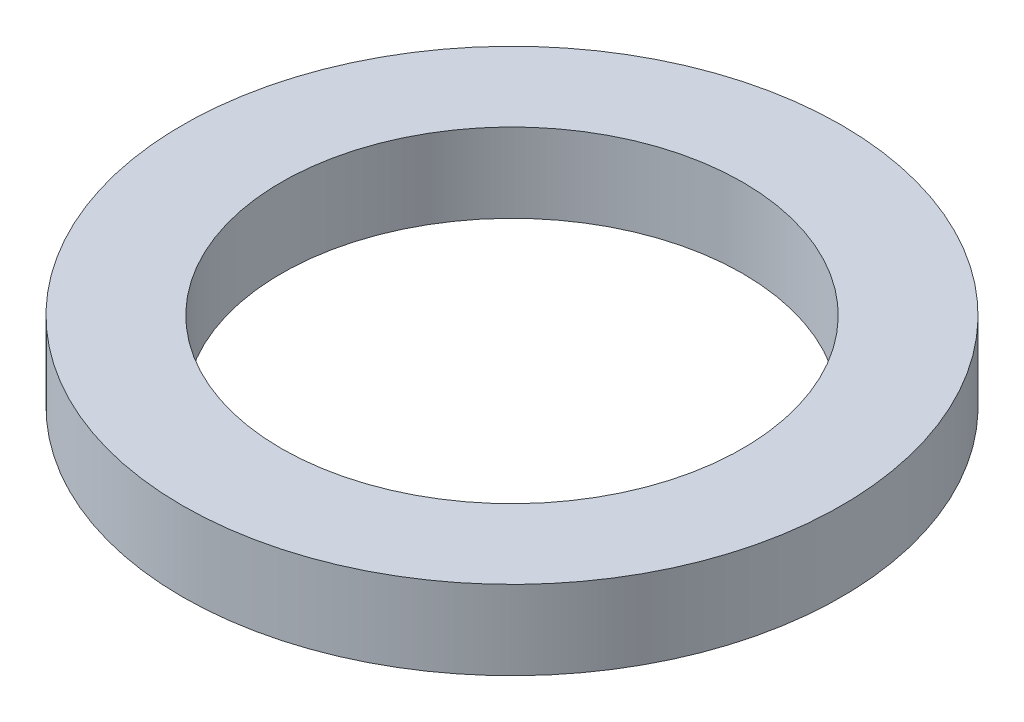
ISO-10303-21;
HEADER;
FILE_DESCRIPTION(('STEP AP214'),'2;1');
FILE_NAME('part.step','',(''),(''),'','','');
FILE_SCHEMA(('AUTOMOTIVE_DESIGN { 1 0 10303 214 1 1 1 1 }'));
ENDSEC;
DATA;
#1=APPLICATION_CONTEXT('core data for automotive mechanical design processes');
#2=APPLICATION_PROTOCOL_DEFINITION('international standard','automotive_design',2000,#1);
#3=PRODUCT_CONTEXT('',#1,'mechanical');
#4=PRODUCT('Part','Part','',(#3));
#5=PRODUCT_RELATED_PRODUCT_CATEGORY('part','',(#4));
#6=PRODUCT_DEFINITION_FORMATION('','',#4);
#7=PRODUCT_DEFINITION_CONTEXT('part definition',#1,'design');
#8=PRODUCT_DEFINITION('design','',#6,#7);
#9=PRODUCT_DEFINITION_SHAPE('','',#8);
#10=(LENGTH_UNIT() NAMED_UNIT(*) SI_UNIT(.MILLI.,.METRE.));
#11=(NAMED_UNIT(*) PLANE_ANGLE_UNIT() SI_UNIT($,.RADIAN.));
#12=(NAMED_UNIT(*) SI_UNIT($,.STERADIAN.) SOLID_ANGLE_UNIT());
#13=UNCERTAINTY_MEASURE_WITH_UNIT(LENGTH_MEASURE(1.E-05),#10,'distance_accuracy_value','');
#14=(GEOMETRIC_REPRESENTATION_CONTEXT(3) GLOBAL_UNCERTAINTY_ASSIGNED_CONTEXT((#13)) GLOBAL_UNIT_ASSIGNED_CONTEXT((#10,
#11,#12)) REPRESENTATION_CONTEXT('',''));
#15=CARTESIAN_POINT('',(0.,0.,0.));
#16=DIRECTION('',(0.,0.,1.));
#17=DIRECTION('',(1.,0.,0.));
#18=AXIS2_PLACEMENT_3D('',#15,#16,#17);
#19=CARTESIAN_POINT('',(0.,0.6,0.));
#20=DIRECTION('',(0.,1.,0.));
#21=DIRECTION('',(0.,0.,1.));
#22=AXIS2_PLACEMENT_3D('',#19,#20,#21);
#23=PLANE('',#22);
#24=CARTESIAN_POINT('',(0.,0.6,0.));
#25=DIRECTION('',(0.,1.,0.));
#26=DIRECTION('',(0.,0.,1.));
#27=AXIS2_PLACEMENT_3D('',#24,#25,#26);
#28=CIRCLE('',#27,2.5);
#29=CARTESIAN_POINT('',(0.,0.6,2.5));
#30=VERTEX_POINT('',#29);
#31=EDGE_CURVE('E10',#30,#30,#28,.T.);
#32=ORIENTED_EDGE('',*,*,#31,.T.);
#33=EDGE_LOOP('',(#32));
#34=FACE_BOUND('',#33,.T.);
#35=CARTESIAN_POINT('',(0.,0.6,0.));
#36=DIRECTION('',(0.,1.,0.));
#37=DIRECTION('',(0.,0.,1.));
#38=AXIS2_PLACEMENT_3D('',#35,#36,#37);
#39=CIRCLE('',#38,1.75);
#40=CARTESIAN_POINT('',(0.,0.6,1.75));
#41=VERTEX_POINT('',#40);
#42=EDGE_CURVE('E42',#41,#41,#39,.T.);
#43=ORIENTED_EDGE('',*,*,#42,.F.);
#44=EDGE_LOOP('',(#43));
#45=FACE_BOUND('',#44,.T.);
#46=ADVANCED_FACE('F31',(#34,#45),#23,.T.);
#47=CARTESIAN_POINT('',(0.,0.,0.));
#48=DIRECTION('',(0.,1.,0.));
#49=DIRECTION('',(0.,0.,1.));
#50=AXIS2_PLACEMENT_3D('',#47,#48,#49);
#51=PLANE('',#50);
#52=CARTESIAN_POINT('',(0.,0.,0.));
#53=DIRECTION('',(0.,1.,0.));
#54=DIRECTION('',(0.,0.,1.));
#55=AXIS2_PLACEMENT_3D('',#52,#53,#54);
#56=CIRCLE('',#55,2.5);
#57=CARTESIAN_POINT('',(0.,0.,2.5));
#58=VERTEX_POINT('',#57);
#59=EDGE_CURVE('E35',#58,#58,#56,.T.);
#60=ORIENTED_EDGE('',*,*,#59,.F.);
#61=EDGE_LOOP('',(#60));
#62=FACE_BOUND('',#61,.T.);
#63=CARTESIAN_POINT('',(0.,0.,0.));
#64=DIRECTION('',(0.,1.,0.));
#65=DIRECTION('',(0.,0.,1.));
#66=AXIS2_PLACEMENT_3D('',#63,#64,#65);
#67=CIRCLE('',#66,1.75);
#68=CARTESIAN_POINT('',(0.,0.,1.75));
#69=VERTEX_POINT('',#68);
#70=EDGE_CURVE('E44',#69,#69,#67,.T.);
#71=ORIENTED_EDGE('',*,*,#70,.T.);
#72=EDGE_LOOP('',(#71));
#73=FACE_BOUND('',#72,.T.);
#74=ADVANCED_FACE('F54',(#62,#73),#51,.F.);
#75=CARTESIAN_POINT('',(0.,0.6,0.));
#76=DIRECTION('',(0.,-1.,0.));
#77=DIRECTION('',(0.,0.,-1.));
#78=AXIS2_PLACEMENT_3D('',#75,#76,#77);
#79=CYLINDRICAL_SURFACE('',#78,2.5);
#80=ORIENTED_EDGE('',*,*,#31,.F.);
#81=EDGE_LOOP('',(#80));
#82=FACE_BOUND('',#81,.T.);
#83=ORIENTED_EDGE('',*,*,#59,.T.);
#84=EDGE_LOOP('',(#83));
#85=FACE_BOUND('',#84,.T.);
#86=ADVANCED_FACE('F33',(#82,#85),#79,.T.);
#87=CARTESIAN_POINT('',(0.,0.6,0.));
#88=DIRECTION('',(0.,-1.,0.));
#89=DIRECTION('',(0.,0.,-1.));
#90=AXIS2_PLACEMENT_3D('',#87,#88,#89);
#91=CYLINDRICAL_SURFACE('',#90,1.75);
#92=ORIENTED_EDGE('',*,*,#42,.T.);
#93=EDGE_LOOP('',(#92));
#94=FACE_BOUND('',#93,.T.);
#95=ORIENTED_EDGE('',*,*,#70,.F.);
#96=EDGE_LOOP('',(#95));
#97=FACE_BOUND('',#96,.T.);
#98=ADVANCED_FACE('F50',(#94,#97),#91,.F.);
#99=CLOSED_SHELL('',(#46,#74,#86,#98));
#100=MANIFOLD_SOLID_BREP('B2',#99);
#101=ADVANCED_BREP_SHAPE_REPRESENTATION('',(#18,#100),#14);
#102=SHAPE_DEFINITION_REPRESENTATION(#9,#101);
ENDSEC;
END-ISO-10303-21;
